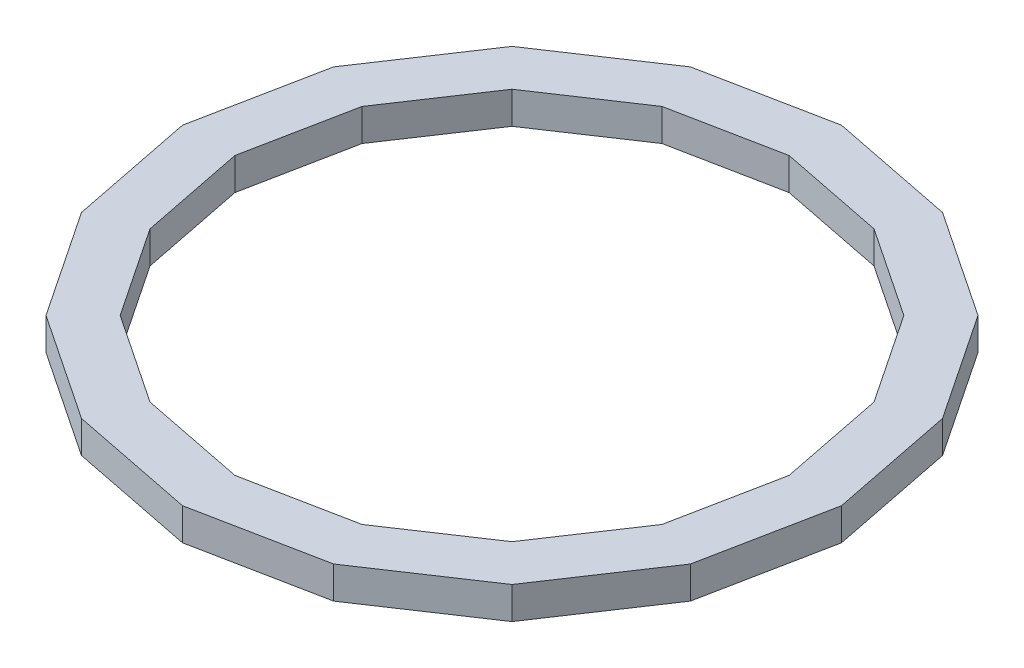
ISO-10303-21;
HEADER;
FILE_DESCRIPTION(('STEP AP214'),'2;1');
FILE_NAME('part.step','',(''),(''),'','','');
FILE_SCHEMA(('AUTOMOTIVE_DESIGN { 1 0 10303 214 1 1 1 1 }'));
ENDSEC;
DATA;
#1=APPLICATION_CONTEXT('core data for automotive mechanical design processes');
#2=APPLICATION_PROTOCOL_DEFINITION('international standard','automotive_design',2000,#1);
#3=PRODUCT_CONTEXT('',#1,'mechanical');
#4=PRODUCT('Part','Part','',(#3));
#5=PRODUCT_RELATED_PRODUCT_CATEGORY('part','',(#4));
#6=PRODUCT_DEFINITION_FORMATION('','',#4);
#7=PRODUCT_DEFINITION_CONTEXT('part definition',#1,'design');
#8=PRODUCT_DEFINITION('design','',#6,#7);
#9=PRODUCT_DEFINITION_SHAPE('','',#8);
#10=(LENGTH_UNIT() NAMED_UNIT(*) SI_UNIT(.MILLI.,.METRE.));
#11=(NAMED_UNIT(*) PLANE_ANGLE_UNIT() SI_UNIT($,.RADIAN.));
#12=(NAMED_UNIT(*) SI_UNIT($,.STERADIAN.) SOLID_ANGLE_UNIT());
#13=UNCERTAINTY_MEASURE_WITH_UNIT(LENGTH_MEASURE(1.E-05),#10,'distance_accuracy_value','');
#14=(GEOMETRIC_REPRESENTATION_CONTEXT(3) GLOBAL_UNCERTAINTY_ASSIGNED_CONTEXT((#13)) GLOBAL_UNIT_ASSIGNED_CONTEXT((#10,
#11,#12)) REPRESENTATION_CONTEXT('',''));
#15=CARTESIAN_POINT('',(0.,0.,0.));
#16=DIRECTION('',(0.,0.,1.));
#17=DIRECTION('',(1.,0.,0.));
#18=AXIS2_PLACEMENT_3D('',#15,#16,#17);
#19=CARTESIAN_POINT('',(0.,19.05,0.));
#20=DIRECTION('',(0.,1.,0.));
#21=DIRECTION('',(0.,0.,1.));
#22=AXIS2_PLACEMENT_3D('',#19,#20,#21);
#23=PLANE('',#22);
#24=DIRECTION('',(0.195090322016117,0.,-0.980785280403233));
#25=VECTOR('',#24,1.);
#26=CARTESIAN_POINT('',(180.428274580275,19.05,74.7358383667241));
#27=LINE('',#26,#25);
#28=CARTESIAN_POINT('',(180.428274580275,19.05,74.7358383667241));
#29=VERTEX_POINT('',#28);
#30=CARTESIAN_POINT('',(195.294157117903,19.05,-2.35922135911837E-12));
#31=VERTEX_POINT('',#30);
#32=EDGE_CURVE('E368',#29,#31,#27,.T.);
#33=ORIENTED_EDGE('',*,*,#32,.T.);
#34=DIRECTION('',(-0.19509032201614,0.,-0.980785280403228));
#35=VECTOR('',#34,1.);
#36=CARTESIAN_POINT('',(195.294157117903,19.05,-2.35922135911837E-12));
#37=LINE('',#36,#35);
#38=CARTESIAN_POINT('',(180.428274580273,19.05,-74.7358383667284));
#39=VERTEX_POINT('',#38);
#40=EDGE_CURVE('E371',#31,#39,#37,.T.);
#41=ORIENTED_EDGE('',*,*,#40,.T.);
#42=DIRECTION('',(-0.555570233019612,0.,-0.831469612302539));
#43=VECTOR('',#42,1.);
#44=CARTESIAN_POINT('',(180.428274580273,19.05,-74.7358383667284));
#45=LINE('',#44,#43);
#46=CARTESIAN_POINT('',(138.093822824179,19.05,-138.093822824182));
#47=VERTEX_POINT('',#46);
#48=EDGE_CURVE('E374',#39,#47,#45,.T.);
#49=ORIENTED_EDGE('',*,*,#48,.T.);
#50=DIRECTION('',(-0.831469612302552,0.,-0.555570233019592));
#51=VECTOR('',#50,1.);
#52=CARTESIAN_POINT('',(138.093822824179,19.05,-138.093822824182));
#53=LINE('',#52,#51);
#54=CARTESIAN_POINT('',(74.7358383667244,19.05,-180.428274580275));
#55=VERTEX_POINT('',#54);
#56=EDGE_CURVE('E376',#47,#55,#53,.T.);
#57=ORIENTED_EDGE('',*,*,#56,.T.);
#58=DIRECTION('',(-0.980785280403233,0.,-0.195090322016117));
#59=VECTOR('',#58,1.);
#60=CARTESIAN_POINT('',(74.7358383667244,19.05,-180.428274580275));
#61=LINE('',#60,#59);
#62=CARTESIAN_POINT('',(-2.24809405567046E-12,19.05,-195.294157117903));
#63=VERTEX_POINT('',#62);
#64=EDGE_CURVE('E378',#55,#63,#61,.T.);
#65=ORIENTED_EDGE('',*,*,#64,.T.);
#66=DIRECTION('',(-0.980785280403228,0.,0.19509032201614));
#67=VECTOR('',#66,1.);
#68=CARTESIAN_POINT('',(-2.24809405567046E-12,19.05,-195.294157117903));
#69=LINE('',#68,#67);
#70=CARTESIAN_POINT('',(-74.7358383667283,19.05,-180.428274580273));
#71=VERTEX_POINT('',#70);
#72=EDGE_CURVE('E380',#63,#71,#69,.T.);
#73=ORIENTED_EDGE('',*,*,#72,.T.);
#74=DIRECTION('',(-0.831469612302539,0.,0.555570233019612));
#75=VECTOR('',#74,1.);
#76=CARTESIAN_POINT('',(-74.7358383667283,19.05,-180.428274580273));
#77=LINE('',#76,#75);
#78=CARTESIAN_POINT('',(-138.093822824182,19.05,-138.093822824179));
#79=VERTEX_POINT('',#78);
#80=EDGE_CURVE('E382',#71,#79,#77,.T.);
#81=ORIENTED_EDGE('',*,*,#80,.T.);
#82=DIRECTION('',(-0.555570233019593,0.,0.831469612302552));
#83=VECTOR('',#82,1.);
#84=CARTESIAN_POINT('',(-138.093822824182,19.05,-138.093822824179));
#85=LINE('',#84,#83);
#86=CARTESIAN_POINT('',(-180.428274580275,19.05,-74.7358383667241));
#87=VERTEX_POINT('',#86);
#88=EDGE_CURVE('E384',#79,#87,#85,.T.);
#89=ORIENTED_EDGE('',*,*,#88,.T.);
#90=DIRECTION('',(-0.195090322016117,0.,0.980785280403233));
#91=VECTOR('',#90,1.);
#92=CARTESIAN_POINT('',(-180.428274580275,19.05,-74.7358383667241));
#93=LINE('',#92,#91);
#94=CARTESIAN_POINT('',(-195.294157117903,19.05,2.29036641027678E-12));
#95=VERTEX_POINT('',#94);
#96=EDGE_CURVE('E387',#87,#95,#93,.T.);
#97=ORIENTED_EDGE('',*,*,#96,.T.);
#98=DIRECTION('',(0.19509032201614,0.,0.980785280403228));
#99=VECTOR('',#98,1.);
#100=CARTESIAN_POINT('',(-195.294157117903,19.05,2.29036641027678E-12));
#101=LINE('',#100,#99);
#102=CARTESIAN_POINT('',(-180.428274580273,19.05,74.7358383667283));
#103=VERTEX_POINT('',#102);
#104=EDGE_CURVE('E389',#95,#103,#101,.T.);
#105=ORIENTED_EDGE('',*,*,#104,.T.);
#106=DIRECTION('',(0.555570233019612,0.,0.831469612302539));
#107=VECTOR('',#106,1.);
#108=CARTESIAN_POINT('',(-180.428274580273,19.05,74.7358383667283));
#109=LINE('',#108,#107);
#110=CARTESIAN_POINT('',(-138.093822824179,19.05,138.093822824182));
#111=VERTEX_POINT('',#110);
#112=EDGE_CURVE('E391',#103,#111,#109,.T.);
#113=ORIENTED_EDGE('',*,*,#112,.T.);
#114=DIRECTION('',(0.831469612302552,0.,0.555570233019592));
#115=VECTOR('',#114,1.);
#116=CARTESIAN_POINT('',(-138.093822824179,19.05,138.093822824182));
#117=LINE('',#116,#115);
#118=CARTESIAN_POINT('',(-74.735838366724,19.05,180.428274580275));
#119=VERTEX_POINT('',#118);
#120=EDGE_CURVE('E393',#111,#119,#117,.T.);
#121=ORIENTED_EDGE('',*,*,#120,.T.);
#122=DIRECTION('',(0.980785280403233,0.,0.195090322016117));
#123=VECTOR('',#122,1.);
#124=CARTESIAN_POINT('',(-74.735838366724,19.05,180.428274580275));
#125=LINE('',#124,#123);
#126=CARTESIAN_POINT('',(2.38062515005987E-12,19.05,195.294157117903));
#127=VERTEX_POINT('',#126);
#128=EDGE_CURVE('E395',#119,#127,#125,.T.);
#129=ORIENTED_EDGE('',*,*,#128,.T.);
#130=DIRECTION('',(0.980785280403228,0.,-0.19509032201614));
#131=VECTOR('',#130,1.);
#132=CARTESIAN_POINT('',(2.38062515005987E-12,19.05,195.294157117903));
#133=LINE('',#132,#131);
#134=CARTESIAN_POINT('',(74.7358383667283,19.05,180.428274580273));
#135=VERTEX_POINT('',#134);
#136=EDGE_CURVE('E397',#127,#135,#133,.T.);
#137=ORIENTED_EDGE('',*,*,#136,.T.);
#138=DIRECTION('',(0.831469612302539,0.,-0.555570233019612));
#139=VECTOR('',#138,1.);
#140=CARTESIAN_POINT('',(74.7358383667283,19.05,180.428274580273));
#141=LINE('',#140,#139);
#142=CARTESIAN_POINT('',(138.093822824182,19.05,138.093822824179));
#143=VERTEX_POINT('',#142);
#144=EDGE_CURVE('E399',#135,#143,#141,.T.);
#145=ORIENTED_EDGE('',*,*,#144,.T.);
#146=DIRECTION('',(0.555570233019593,0.,-0.831469612302552));
#147=VECTOR('',#146,1.);
#148=CARTESIAN_POINT('',(138.093822824182,19.05,138.093822824179));
#149=LINE('',#148,#147);
#150=EDGE_CURVE('E402',#143,#29,#149,.T.);
#151=ORIENTED_EDGE('',*,*,#150,.T.);
#152=EDGE_LOOP('',(#33,#41,#49,#57,#65,#73,#81,#89,#97,#105,#113,#121,#129,#137,#145,#151));
#153=FACE_BOUND('',#152,.T.);
#154=DIRECTION('',(-0.19509032201614,0.,-0.980785280403228));
#155=VECTOR('',#154,1.);
#156=CARTESIAN_POINT('',(164.217018615714,19.05,-1.98429536478422E-12));
#157=LINE('',#156,#155);
#158=CARTESIAN_POINT('',(164.217018615714,19.05,-1.98429536478422E-12));
#159=VERTEX_POINT('',#158);
#160=CARTESIAN_POINT('',(151.716742389082,19.05,-62.8431323366249));
#161=VERTEX_POINT('',#160);
#162=EDGE_CURVE('E252',#159,#161,#157,.T.);
#163=ORIENTED_EDGE('',*,*,#162,.F.);
#164=DIRECTION('',(0.195090322016117,0.,-0.980785280403233));
#165=VECTOR('',#164,1.);
#166=CARTESIAN_POINT('',(151.716742389083,19.05,62.8431323366213));
#167=LINE('',#166,#165);
#168=CARTESIAN_POINT('',(151.716742389083,19.05,62.8431323366213));
#169=VERTEX_POINT('',#168);
#170=EDGE_CURVE('E243',#169,#159,#167,.T.);
#171=ORIENTED_EDGE('',*,*,#170,.F.);
#172=DIRECTION('',(0.555570233019592,0.,-0.831469612302552));
#173=VECTOR('',#172,1.);
#174=CARTESIAN_POINT('',(116.11896744941,19.05,116.118967449407));
#175=LINE('',#174,#173);
#176=CARTESIAN_POINT('',(116.11896744941,19.05,116.118967449407));
#177=VERTEX_POINT('',#176);
#178=EDGE_CURVE('E294',#177,#169,#175,.T.);
#179=ORIENTED_EDGE('',*,*,#178,.F.);
#180=DIRECTION('',(0.831469612302539,0.,-0.555570233019612));
#181=VECTOR('',#180,1.);
#182=CARTESIAN_POINT('',(62.8431323366249,19.05,151.716742389082));
#183=LINE('',#182,#181);
#184=CARTESIAN_POINT('',(62.8431323366249,19.05,151.716742389082));
#185=VERTEX_POINT('',#184);
#186=EDGE_CURVE('E292',#185,#177,#183,.T.);
#187=ORIENTED_EDGE('',*,*,#186,.F.);
#188=DIRECTION('',(0.980785280403228,0.,-0.19509032201614));
#189=VECTOR('',#188,1.);
#190=CARTESIAN_POINT('',(1.95797760770945E-12,19.05,164.217018615714));
#191=LINE('',#190,#189);
#192=CARTESIAN_POINT('',(1.95797760770945E-12,19.05,164.217018615714));
#193=VERTEX_POINT('',#192);
#194=EDGE_CURVE('E290',#193,#185,#191,.T.);
#195=ORIENTED_EDGE('',*,*,#194,.F.);
#196=DIRECTION('',(0.980785280403233,0.,0.195090322016117));
#197=VECTOR('',#196,1.);
#198=CARTESIAN_POINT('',(-62.8431323366212,19.05,151.716742389083));
#199=LINE('',#198,#197);
#200=CARTESIAN_POINT('',(-62.8431323366212,19.05,151.716742389083));
#201=VERTEX_POINT('',#200);
#202=EDGE_CURVE('E288',#201,#193,#199,.T.);
#203=ORIENTED_EDGE('',*,*,#202,.F.);
#204=DIRECTION('',(0.831469612302552,0.,0.555570233019592));
#205=VECTOR('',#204,1.);
#206=CARTESIAN_POINT('',(-116.118967449407,19.05,116.11896744941));
#207=LINE('',#206,#205);
#208=CARTESIAN_POINT('',(-116.118967449407,19.05,116.11896744941));
#209=VERTEX_POINT('',#208);
#210=EDGE_CURVE('E286',#209,#201,#207,.T.);
#211=ORIENTED_EDGE('',*,*,#210,.F.);
#212=DIRECTION('',(0.555570233019612,0.,0.831469612302539));
#213=VECTOR('',#212,1.);
#214=CARTESIAN_POINT('',(-151.716742389082,19.05,62.843132336625));
#215=LINE('',#214,#213);
#216=CARTESIAN_POINT('',(-151.716742389082,19.05,62.843132336625));
#217=VERTEX_POINT('',#216);
#218=EDGE_CURVE('E284',#217,#209,#215,.T.);
#219=ORIENTED_EDGE('',*,*,#218,.F.);
#220=DIRECTION('',(0.19509032201614,0.,0.980785280403228));
#221=VECTOR('',#220,1.);
#222=CARTESIAN_POINT('',(-164.217018615713,19.05,2.00504577697434E-12));
#223=LINE('',#222,#221);
#224=CARTESIAN_POINT('',(-164.217018615713,19.05,2.00504577697434E-12));
#225=VERTEX_POINT('',#224);
#226=EDGE_CURVE('E282',#225,#217,#223,.T.);
#227=ORIENTED_EDGE('',*,*,#226,.F.);
#228=DIRECTION('',(-0.195090322016116,0.,0.980785280403233));
#229=VECTOR('',#228,1.);
#230=CARTESIAN_POINT('',(-151.716742389083,19.05,-62.8431323366213));
#231=LINE('',#230,#229);
#232=CARTESIAN_POINT('',(-151.716742389083,19.05,-62.8431323366213));
#233=VERTEX_POINT('',#232);
#234=EDGE_CURVE('E279',#233,#225,#231,.T.);
#235=ORIENTED_EDGE('',*,*,#234,.F.);
#236=DIRECTION('',(-0.555570233019592,0.,0.831469612302552));
#237=VECTOR('',#236,1.);
#238=CARTESIAN_POINT('',(-116.11896744941,19.05,-116.118967449407));
#239=LINE('',#238,#237);
#240=CARTESIAN_POINT('',(-116.11896744941,19.05,-116.118967449407));
#241=VERTEX_POINT('',#240);
#242=EDGE_CURVE('E277',#241,#233,#239,.T.);
#243=ORIENTED_EDGE('',*,*,#242,.F.);
#244=DIRECTION('',(-0.831469612302539,0.,0.555570233019612));
#245=VECTOR('',#244,1.);
#246=CARTESIAN_POINT('',(-62.8431323366248,19.05,-151.716742389082));
#247=LINE('',#246,#245);
#248=CARTESIAN_POINT('',(-62.8431323366248,19.05,-151.716742389082));
#249=VERTEX_POINT('',#248);
#250=EDGE_CURVE('E275',#249,#241,#247,.T.);
#251=ORIENTED_EDGE('',*,*,#250,.F.);
#252=DIRECTION('',(-0.980785280403228,0.,0.19509032201614));
#253=VECTOR('',#252,1.);
#254=CARTESIAN_POINT('',(-1.97042515166565E-12,19.05,-164.217018615713));
#255=LINE('',#254,#253);
#256=CARTESIAN_POINT('',(-1.97042515166565E-12,19.05,-164.217018615713));
#257=VERTEX_POINT('',#256);
#258=EDGE_CURVE('E273',#257,#249,#255,.T.);
#259=ORIENTED_EDGE('',*,*,#258,.F.);
#260=DIRECTION('',(-0.980785280403233,0.,-0.195090322016117));
#261=VECTOR('',#260,1.);
#262=CARTESIAN_POINT('',(62.8431323366215,19.05,-151.716742389083));
#263=LINE('',#262,#261);
#264=CARTESIAN_POINT('',(62.8431323366215,19.05,-151.716742389083));
#265=VERTEX_POINT('',#264);
#266=EDGE_CURVE('E271',#265,#257,#263,.T.);
#267=ORIENTED_EDGE('',*,*,#266,.F.);
#268=DIRECTION('',(-0.831469612302552,0.,-0.555570233019592));
#269=VECTOR('',#268,1.);
#270=CARTESIAN_POINT('',(116.118967449407,19.05,-116.11896744941));
#271=LINE('',#270,#269);
#272=CARTESIAN_POINT('',(116.118967449407,19.05,-116.11896744941));
#273=VERTEX_POINT('',#272);
#274=EDGE_CURVE('E267',#273,#265,#271,.T.);
#275=ORIENTED_EDGE('',*,*,#274,.F.);
#276=DIRECTION('',(-0.555570233019612,0.,-0.831469612302539));
#277=VECTOR('',#276,1.);
#278=CARTESIAN_POINT('',(151.716742389082,19.05,-62.8431323366249));
#279=LINE('',#278,#277);
#280=EDGE_CURVE('E265',#161,#273,#279,.T.);
#281=ORIENTED_EDGE('',*,*,#280,.F.);
#282=EDGE_LOOP('',(#163,#171,#179,#187,#195,#203,#211,#219,#227,#235,#243,#251,#259,#267,#275,#281));
#283=FACE_BOUND('',#282,.T.);
#284=ADVANCED_FACE('F34',(#153,#283),#23,.T.);
#285=CARTESIAN_POINT('',(0.,0.,0.));
#286=DIRECTION('',(0.,1.,0.));
#287=DIRECTION('',(0.,0.,1.));
#288=AXIS2_PLACEMENT_3D('',#285,#286,#287);
#289=PLANE('',#288);
#290=DIRECTION('',(0.195090322016117,0.,-0.980785280403233));
#291=VECTOR('',#290,1.);
#292=CARTESIAN_POINT('',(180.428274580275,0.,74.7358383667241));
#293=LINE('',#292,#291);
#294=CARTESIAN_POINT('',(180.428274580275,0.,74.7358383667241));
#295=VERTEX_POINT('',#294);
#296=CARTESIAN_POINT('',(195.294157117903,0.,-2.35922135911837E-12));
#297=VERTEX_POINT('',#296);
#298=EDGE_CURVE('E260',#295,#297,#293,.T.);
#299=ORIENTED_EDGE('',*,*,#298,.F.);
#300=DIRECTION('',(0.555570233019593,0.,-0.831469612302552));
#301=VECTOR('',#300,1.);
#302=CARTESIAN_POINT('',(138.093822824182,0.,138.093822824179));
#303=LINE('',#302,#301);
#304=CARTESIAN_POINT('',(138.093822824182,0.,138.093822824179));
#305=VERTEX_POINT('',#304);
#306=EDGE_CURVE('E372',#305,#295,#303,.T.);
#307=ORIENTED_EDGE('',*,*,#306,.F.);
#308=DIRECTION('',(0.831469612302539,0.,-0.555570233019612));
#309=VECTOR('',#308,1.);
#310=CARTESIAN_POINT('',(74.7358383667283,0.,180.428274580273));
#311=LINE('',#310,#309);
#312=CARTESIAN_POINT('',(74.7358383667283,0.,180.428274580273));
#313=VERTEX_POINT('',#312);
#314=EDGE_CURVE('E433',#313,#305,#311,.T.);
#315=ORIENTED_EDGE('',*,*,#314,.F.);
#316=DIRECTION('',(0.980785280403228,0.,-0.19509032201614));
#317=VECTOR('',#316,1.);
#318=CARTESIAN_POINT('',(2.38062515005987E-12,0.,195.294157117903));
#319=LINE('',#318,#317);
#320=CARTESIAN_POINT('',(2.38062515005987E-12,0.,195.294157117903));
#321=VERTEX_POINT('',#320);
#322=EDGE_CURVE('E431',#321,#313,#319,.T.);
#323=ORIENTED_EDGE('',*,*,#322,.F.);
#324=DIRECTION('',(0.980785280403233,0.,0.195090322016117));
#325=VECTOR('',#324,1.);
#326=CARTESIAN_POINT('',(-74.735838366724,0.,180.428274580275));
#327=LINE('',#326,#325);
#328=CARTESIAN_POINT('',(-74.735838366724,0.,180.428274580275));
#329=VERTEX_POINT('',#328);
#330=EDGE_CURVE('E429',#329,#321,#327,.T.);
#331=ORIENTED_EDGE('',*,*,#330,.F.);
#332=DIRECTION('',(0.831469612302552,0.,0.555570233019592));
#333=VECTOR('',#332,1.);
#334=CARTESIAN_POINT('',(-138.093822824179,0.,138.093822824182));
#335=LINE('',#334,#333);
#336=CARTESIAN_POINT('',(-138.093822824179,0.,138.093822824182));
#337=VERTEX_POINT('',#336);
#338=EDGE_CURVE('E427',#337,#329,#335,.T.);
#339=ORIENTED_EDGE('',*,*,#338,.F.);
#340=DIRECTION('',(0.555570233019612,0.,0.831469612302539));
#341=VECTOR('',#340,1.);
#342=CARTESIAN_POINT('',(-180.428274580273,0.,74.7358383667283));
#343=LINE('',#342,#341);
#344=CARTESIAN_POINT('',(-180.428274580273,0.,74.7358383667283));
#345=VERTEX_POINT('',#344);
#346=EDGE_CURVE('E425',#345,#337,#343,.T.);
#347=ORIENTED_EDGE('',*,*,#346,.F.);
#348=DIRECTION('',(0.19509032201614,0.,0.980785280403228));
#349=VECTOR('',#348,1.);
#350=CARTESIAN_POINT('',(-195.294157117903,0.,2.29036641027678E-12));
#351=LINE('',#350,#349);
#352=CARTESIAN_POINT('',(-195.294157117903,0.,2.29036641027678E-12));
#353=VERTEX_POINT('',#352);
#354=EDGE_CURVE('E423',#353,#345,#351,.T.);
#355=ORIENTED_EDGE('',*,*,#354,.F.);
#356=DIRECTION('',(-0.195090322016117,0.,0.980785280403233));
#357=VECTOR('',#356,1.);
#358=CARTESIAN_POINT('',(-180.428274580275,0.,-74.7358383667241));
#359=LINE('',#358,#357);
#360=CARTESIAN_POINT('',(-180.428274580275,0.,-74.7358383667241));
#361=VERTEX_POINT('',#360);
#362=EDGE_CURVE('E421',#361,#353,#359,.T.);
#363=ORIENTED_EDGE('',*,*,#362,.F.);
#364=DIRECTION('',(-0.555570233019593,0.,0.831469612302552));
#365=VECTOR('',#364,1.);
#366=CARTESIAN_POINT('',(-138.093822824182,0.,-138.093822824179));
#367=LINE('',#366,#365);
#368=CARTESIAN_POINT('',(-138.093822824182,0.,-138.093822824179));
#369=VERTEX_POINT('',#368);
#370=EDGE_CURVE('E419',#369,#361,#367,.T.);
#371=ORIENTED_EDGE('',*,*,#370,.F.);
#372=DIRECTION('',(-0.831469612302539,0.,0.555570233019612));
#373=VECTOR('',#372,1.);
#374=CARTESIAN_POINT('',(-74.7358383667283,0.,-180.428274580273));
#375=LINE('',#374,#373);
#376=CARTESIAN_POINT('',(-74.7358383667283,0.,-180.428274580273));
#377=VERTEX_POINT('',#376);
#378=EDGE_CURVE('E417',#377,#369,#375,.T.);
#379=ORIENTED_EDGE('',*,*,#378,.F.);
#380=DIRECTION('',(-0.980785280403228,0.,0.19509032201614));
#381=VECTOR('',#380,1.);
#382=CARTESIAN_POINT('',(-2.24809405567046E-12,0.,-195.294157117903));
#383=LINE('',#382,#381);
#384=CARTESIAN_POINT('',(-2.24809405567046E-12,0.,-195.294157117903));
#385=VERTEX_POINT('',#384);
#386=EDGE_CURVE('E415',#385,#377,#383,.T.);
#387=ORIENTED_EDGE('',*,*,#386,.F.);
#388=DIRECTION('',(-0.980785280403233,0.,-0.195090322016117));
#389=VECTOR('',#388,1.);
#390=CARTESIAN_POINT('',(74.7358383667244,0.,-180.428274580275));
#391=LINE('',#390,#389);
#392=CARTESIAN_POINT('',(74.7358383667244,0.,-180.428274580275));
#393=VERTEX_POINT('',#392);
#394=EDGE_CURVE('E413',#393,#385,#391,.T.);
#395=ORIENTED_EDGE('',*,*,#394,.F.);
#396=DIRECTION('',(-0.831469612302552,0.,-0.555570233019592));
#397=VECTOR('',#396,1.);
#398=CARTESIAN_POINT('',(138.093822824179,0.,-138.093822824182));
#399=LINE('',#398,#397);
#400=CARTESIAN_POINT('',(138.093822824179,0.,-138.093822824182));
#401=VERTEX_POINT('',#400);
#402=EDGE_CURVE('E411',#401,#393,#399,.T.);
#403=ORIENTED_EDGE('',*,*,#402,.F.);
#404=DIRECTION('',(-0.555570233019612,0.,-0.831469612302539));
#405=VECTOR('',#404,1.);
#406=CARTESIAN_POINT('',(180.428274580273,0.,-74.7358383667284));
#407=LINE('',#406,#405);
#408=CARTESIAN_POINT('',(180.428274580273,0.,-74.7358383667284));
#409=VERTEX_POINT('',#408);
#410=EDGE_CURVE('E409',#409,#401,#407,.T.);
#411=ORIENTED_EDGE('',*,*,#410,.F.);
#412=DIRECTION('',(-0.19509032201614,0.,-0.980785280403228));
#413=VECTOR('',#412,1.);
#414=CARTESIAN_POINT('',(195.294157117903,0.,-2.35922135911837E-12));
#415=LINE('',#414,#413);
#416=EDGE_CURVE('E407',#297,#409,#415,.T.);
#417=ORIENTED_EDGE('',*,*,#416,.F.);
#418=EDGE_LOOP('',(#299,#307,#315,#323,#331,#339,#347,#355,#363,#371,#379,#387,#395,#403,#411,#417));
#419=FACE_BOUND('',#418,.T.);
#420=DIRECTION('',(0.195090322016117,0.,-0.980785280403233));
#421=VECTOR('',#420,1.);
#422=CARTESIAN_POINT('',(151.716742389083,0.,62.8431323366213));
#423=LINE('',#422,#421);
#424=CARTESIAN_POINT('',(151.716742389083,0.,62.8431323366213));
#425=VERTEX_POINT('',#424);
#426=CARTESIAN_POINT('',(164.217018615714,0.,-1.98429536478422E-12));
#427=VERTEX_POINT('',#426);
#428=EDGE_CURVE('E57',#425,#427,#423,.T.);
#429=ORIENTED_EDGE('',*,*,#428,.T.);
#430=DIRECTION('',(-0.19509032201614,0.,-0.980785280403228));
#431=VECTOR('',#430,1.);
#432=CARTESIAN_POINT('',(164.217018615714,0.,-1.98429536478422E-12));
#433=LINE('',#432,#431);
#434=CARTESIAN_POINT('',(151.716742389082,0.,-62.8431323366249));
#435=VERTEX_POINT('',#434);
#436=EDGE_CURVE('E259',#427,#435,#433,.T.);
#437=ORIENTED_EDGE('',*,*,#436,.T.);
#438=DIRECTION('',(-0.555570233019612,0.,-0.831469612302539));
#439=VECTOR('',#438,1.);
#440=CARTESIAN_POINT('',(151.716742389082,0.,-62.8431323366249));
#441=LINE('',#440,#439);
#442=CARTESIAN_POINT('',(116.118967449407,0.,-116.11896744941));
#443=VERTEX_POINT('',#442);
#444=EDGE_CURVE('E298',#435,#443,#441,.T.);
#445=ORIENTED_EDGE('',*,*,#444,.T.);
#446=DIRECTION('',(-0.831469612302552,0.,-0.555570233019592));
#447=VECTOR('',#446,1.);
#448=CARTESIAN_POINT('',(116.118967449407,0.,-116.11896744941));
#449=LINE('',#448,#447);
#450=CARTESIAN_POINT('',(62.8431323366215,0.,-151.716742389083));
#451=VERTEX_POINT('',#450);
#452=EDGE_CURVE('E301',#443,#451,#449,.T.);
#453=ORIENTED_EDGE('',*,*,#452,.T.);
#454=DIRECTION('',(-0.980785280403233,0.,-0.195090322016117));
#455=VECTOR('',#454,1.);
#456=CARTESIAN_POINT('',(62.8431323366215,0.,-151.716742389083));
#457=LINE('',#456,#455);
#458=CARTESIAN_POINT('',(-1.97042515166565E-12,0.,-164.217018615713));
#459=VERTEX_POINT('',#458);
#460=EDGE_CURVE('E304',#451,#459,#457,.T.);
#461=ORIENTED_EDGE('',*,*,#460,.T.);
#462=DIRECTION('',(-0.980785280403228,0.,0.19509032201614));
#463=VECTOR('',#462,1.);
#464=CARTESIAN_POINT('',(-1.97042515166565E-12,0.,-164.217018615713));
#465=LINE('',#464,#463);
#466=CARTESIAN_POINT('',(-62.8431323366248,0.,-151.716742389082));
#467=VERTEX_POINT('',#466);
#468=EDGE_CURVE('E307',#459,#467,#465,.T.);
#469=ORIENTED_EDGE('',*,*,#468,.T.);
#470=DIRECTION('',(-0.831469612302539,0.,0.555570233019612));
#471=VECTOR('',#470,1.);
#472=CARTESIAN_POINT('',(-62.8431323366248,0.,-151.716742389082));
#473=LINE('',#472,#471);
#474=CARTESIAN_POINT('',(-116.11896744941,0.,-116.118967449407));
#475=VERTEX_POINT('',#474);
#476=EDGE_CURVE('E310',#467,#475,#473,.T.);
#477=ORIENTED_EDGE('',*,*,#476,.T.);
#478=DIRECTION('',(-0.555570233019592,0.,0.831469612302552));
#479=VECTOR('',#478,1.);
#480=CARTESIAN_POINT('',(-116.11896744941,0.,-116.118967449407));
#481=LINE('',#480,#479);
#482=CARTESIAN_POINT('',(-151.716742389083,0.,-62.8431323366213));
#483=VERTEX_POINT('',#482);
#484=EDGE_CURVE('E313',#475,#483,#481,.T.);
#485=ORIENTED_EDGE('',*,*,#484,.T.);
#486=DIRECTION('',(-0.195090322016116,0.,0.980785280403233));
#487=VECTOR('',#486,1.);
#488=CARTESIAN_POINT('',(-151.716742389083,0.,-62.8431323366213));
#489=LINE('',#488,#487);
#490=CARTESIAN_POINT('',(-164.217018615713,0.,2.00504577697434E-12));
#491=VERTEX_POINT('',#490);
#492=EDGE_CURVE('E316',#483,#491,#489,.T.);
#493=ORIENTED_EDGE('',*,*,#492,.T.);
#494=DIRECTION('',(0.19509032201614,0.,0.980785280403228));
#495=VECTOR('',#494,1.);
#496=CARTESIAN_POINT('',(-164.217018615713,0.,2.00504577697434E-12));
#497=LINE('',#496,#495);
#498=CARTESIAN_POINT('',(-151.716742389082,0.,62.843132336625));
#499=VERTEX_POINT('',#498);
#500=EDGE_CURVE('E320',#491,#499,#497,.T.);
#501=ORIENTED_EDGE('',*,*,#500,.T.);
#502=DIRECTION('',(0.555570233019612,0.,0.831469612302539));
#503=VECTOR('',#502,1.);
#504=CARTESIAN_POINT('',(-151.716742389082,0.,62.843132336625));
#505=LINE('',#504,#503);
#506=CARTESIAN_POINT('',(-116.118967449407,0.,116.11896744941));
#507=VERTEX_POINT('',#506);
#508=EDGE_CURVE('E323',#499,#507,#505,.T.);
#509=ORIENTED_EDGE('',*,*,#508,.T.);
#510=DIRECTION('',(0.831469612302552,0.,0.555570233019592));
#511=VECTOR('',#510,1.);
#512=CARTESIAN_POINT('',(-116.118967449407,0.,116.11896744941));
#513=LINE('',#512,#511);
#514=CARTESIAN_POINT('',(-62.8431323366212,0.,151.716742389083));
#515=VERTEX_POINT('',#514);
#516=EDGE_CURVE('E326',#507,#515,#513,.T.);
#517=ORIENTED_EDGE('',*,*,#516,.T.);
#518=DIRECTION('',(0.980785280403233,0.,0.195090322016117));
#519=VECTOR('',#518,1.);
#520=CARTESIAN_POINT('',(-62.8431323366212,0.,151.716742389083));
#521=LINE('',#520,#519);
#522=CARTESIAN_POINT('',(1.95797760770945E-12,0.,164.217018615714));
#523=VERTEX_POINT('',#522);
#524=EDGE_CURVE('E329',#515,#523,#521,.T.);
#525=ORIENTED_EDGE('',*,*,#524,.T.);
#526=DIRECTION('',(0.980785280403228,0.,-0.19509032201614));
#527=VECTOR('',#526,1.);
#528=CARTESIAN_POINT('',(1.95797760770945E-12,0.,164.217018615714));
#529=LINE('',#528,#527);
#530=CARTESIAN_POINT('',(62.8431323366249,0.,151.716742389082));
#531=VERTEX_POINT('',#530);
#532=EDGE_CURVE('E332',#523,#531,#529,.T.);
#533=ORIENTED_EDGE('',*,*,#532,.T.);
#534=DIRECTION('',(0.831469612302539,0.,-0.555570233019612));
#535=VECTOR('',#534,1.);
#536=CARTESIAN_POINT('',(62.8431323366249,0.,151.716742389082));
#537=LINE('',#536,#535);
#538=CARTESIAN_POINT('',(116.11896744941,0.,116.118967449407));
#539=VERTEX_POINT('',#538);
#540=EDGE_CURVE('E335',#531,#539,#537,.T.);
#541=ORIENTED_EDGE('',*,*,#540,.T.);
#542=DIRECTION('',(0.555570233019592,0.,-0.831469612302552));
#543=VECTOR('',#542,1.);
#544=CARTESIAN_POINT('',(116.11896744941,0.,116.118967449407));
#545=LINE('',#544,#543);
#546=EDGE_CURVE('E253',#539,#425,#545,.T.);
#547=ORIENTED_EDGE('',*,*,#546,.T.);
#548=EDGE_LOOP('',(#429,#437,#445,#453,#461,#469,#477,#485,#493,#501,#509,#517,#525,#533,#541,#547));
#549=FACE_BOUND('',#548,.T.);
#550=ADVANCED_FACE('F488',(#419,#549),#289,.F.);
#551=CARTESIAN_POINT('',(180.428274580275,19.05,74.7358383667241));
#552=DIRECTION('',(-0.980785280403233,0.,-0.195090322016117));
#553=DIRECTION('',(-0.195090322016117,0.,0.980785280403233));
#554=AXIS2_PLACEMENT_3D('',#551,#552,#553);
#555=PLANE('',#554);
#556=ORIENTED_EDGE('',*,*,#298,.T.);
#557=DIRECTION('',(0.,-1.,0.));
#558=VECTOR('',#557,1.);
#559=CARTESIAN_POINT('',(195.294157117903,19.05,-2.35922135911837E-12));
#560=LINE('',#559,#558);
#561=EDGE_CURVE('E11',#31,#297,#560,.T.);
#562=ORIENTED_EDGE('',*,*,#561,.F.);
#563=ORIENTED_EDGE('',*,*,#32,.F.);
#564=DIRECTION('',(0.,-1.,0.));
#565=VECTOR('',#564,1.);
#566=CARTESIAN_POINT('',(180.428274580275,19.05,74.7358383667241));
#567=LINE('',#566,#565);
#568=EDGE_CURVE('E404',#29,#295,#567,.T.);
#569=ORIENTED_EDGE('',*,*,#568,.T.);
#570=EDGE_LOOP('',(#556,#562,#563,#569));
#571=FACE_BOUND('',#570,.T.);
#572=ADVANCED_FACE('F36',(#571),#555,.F.);
#573=CARTESIAN_POINT('',(195.294157117903,19.05,-2.35922135911837E-12));
#574=DIRECTION('',(-0.980785280403228,0.,0.19509032201614));
#575=DIRECTION('',(0.19509032201614,0.,0.980785280403228));
#576=AXIS2_PLACEMENT_3D('',#573,#574,#575);
#577=PLANE('',#576);
#578=ORIENTED_EDGE('',*,*,#416,.T.);
#579=DIRECTION('',(0.,-1.,0.));
#580=VECTOR('',#579,1.);
#581=CARTESIAN_POINT('',(180.428274580273,19.05,-74.7358383667284));
#582=LINE('',#581,#580);
#583=EDGE_CURVE('E42',#39,#409,#582,.T.);
#584=ORIENTED_EDGE('',*,*,#583,.F.);
#585=ORIENTED_EDGE('',*,*,#40,.F.);
#586=ORIENTED_EDGE('',*,*,#561,.T.);
#587=EDGE_LOOP('',(#578,#584,#585,#586));
#588=FACE_BOUND('',#587,.T.);
#589=ADVANCED_FACE('F505',(#588),#577,.F.);
#590=CARTESIAN_POINT('',(180.428274580273,19.05,-74.7358383667284));
#591=DIRECTION('',(-0.831469612302539,0.,0.555570233019612));
#592=DIRECTION('',(0.555570233019612,0.,0.831469612302539));
#593=AXIS2_PLACEMENT_3D('',#590,#591,#592);
#594=PLANE('',#593);
#595=ORIENTED_EDGE('',*,*,#410,.T.);
#596=DIRECTION('',(0.,-1.,0.));
#597=VECTOR('',#596,1.);
#598=CARTESIAN_POINT('',(138.093822824179,19.05,-138.093822824182));
#599=LINE('',#598,#597);
#600=EDGE_CURVE('E475',#47,#401,#599,.T.);
#601=ORIENTED_EDGE('',*,*,#600,.F.);
#602=ORIENTED_EDGE('',*,*,#48,.F.);
#603=ORIENTED_EDGE('',*,*,#583,.T.);
#604=EDGE_LOOP('',(#595,#601,#602,#603));
#605=FACE_BOUND('',#604,.T.);
#606=ADVANCED_FACE('F482',(#605),#594,.F.);
#607=CARTESIAN_POINT('',(138.093822824179,19.05,-138.093822824182));
#608=DIRECTION('',(-0.555570233019592,0.,0.831469612302552));
#609=DIRECTION('',(0.831469612302552,0.,0.555570233019592));
#610=AXIS2_PLACEMENT_3D('',#607,#608,#609);
#611=PLANE('',#610);
#612=ORIENTED_EDGE('',*,*,#402,.T.);
#613=DIRECTION('',(0.,-1.,0.));
#614=VECTOR('',#613,1.);
#615=CARTESIAN_POINT('',(74.7358383667244,19.05,-180.428274580275));
#616=LINE('',#615,#614);
#617=EDGE_CURVE('E471',#55,#393,#616,.T.);
#618=ORIENTED_EDGE('',*,*,#617,.F.);
#619=ORIENTED_EDGE('',*,*,#56,.F.);
#620=ORIENTED_EDGE('',*,*,#600,.T.);
#621=EDGE_LOOP('',(#612,#618,#619,#620));
#622=FACE_BOUND('',#621,.T.);
#623=ADVANCED_FACE('F494',(#622),#611,.F.);
#624=CARTESIAN_POINT('',(74.7358383667244,19.05,-180.428274580275));
#625=DIRECTION('',(-0.195090322016117,0.,0.980785280403233));
#626=DIRECTION('',(0.980785280403233,0.,0.195090322016117));
#627=AXIS2_PLACEMENT_3D('',#624,#625,#626);
#628=PLANE('',#627);
#629=ORIENTED_EDGE('',*,*,#394,.T.);
#630=DIRECTION('',(0.,-1.,0.));
#631=VECTOR('',#630,1.);
#632=CARTESIAN_POINT('',(-2.24809405567046E-12,19.05,-195.294157117903));
#633=LINE('',#632,#631);
#634=EDGE_CURVE('E468',#63,#385,#633,.T.);
#635=ORIENTED_EDGE('',*,*,#634,.F.);
#636=ORIENTED_EDGE('',*,*,#64,.F.);
#637=ORIENTED_EDGE('',*,*,#617,.T.);
#638=EDGE_LOOP('',(#629,#635,#636,#637));
#639=FACE_BOUND('',#638,.T.);
#640=ADVANCED_FACE('F498',(#639),#628,.F.);
#641=CARTESIAN_POINT('',(-2.24809405567046E-12,19.05,-195.294157117903));
#642=DIRECTION('',(0.19509032201614,0.,0.980785280403228));
#643=DIRECTION('',(0.980785280403228,0.,-0.19509032201614));
#644=AXIS2_PLACEMENT_3D('',#641,#642,#643);
#645=PLANE('',#644);
#646=ORIENTED_EDGE('',*,*,#386,.T.);
#647=DIRECTION('',(0.,-1.,0.));
#648=VECTOR('',#647,1.);
#649=CARTESIAN_POINT('',(-74.7358383667283,19.05,-180.428274580273));
#650=LINE('',#649,#648);
#651=EDGE_CURVE('E465',#71,#377,#650,.T.);
#652=ORIENTED_EDGE('',*,*,#651,.F.);
#653=ORIENTED_EDGE('',*,*,#72,.F.);
#654=ORIENTED_EDGE('',*,*,#634,.T.);
#655=EDGE_LOOP('',(#646,#652,#653,#654));
#656=FACE_BOUND('',#655,.T.);
#657=ADVANCED_FACE('F558',(#656),#645,.F.);
#658=CARTESIAN_POINT('',(-74.7358383667283,19.05,-180.428274580273));
#659=DIRECTION('',(0.555570233019612,0.,0.831469612302539));
#660=DIRECTION('',(0.831469612302539,0.,-0.555570233019612));
#661=AXIS2_PLACEMENT_3D('',#658,#659,#660);
#662=PLANE('',#661);
#663=ORIENTED_EDGE('',*,*,#378,.T.);
#664=DIRECTION('',(0.,-1.,0.));
#665=VECTOR('',#664,1.);
#666=CARTESIAN_POINT('',(-138.093822824182,19.05,-138.093822824179));
#667=LINE('',#666,#665);
#668=EDGE_CURVE('E462',#79,#369,#667,.T.);
#669=ORIENTED_EDGE('',*,*,#668,.F.);
#670=ORIENTED_EDGE('',*,*,#80,.F.);
#671=ORIENTED_EDGE('',*,*,#651,.T.);
#672=EDGE_LOOP('',(#663,#669,#670,#671));
#673=FACE_BOUND('',#672,.T.);
#674=ADVANCED_FACE('F555',(#673),#662,.F.);
#675=CARTESIAN_POINT('',(-138.093822824182,19.05,-138.093822824179));
#676=DIRECTION('',(0.831469612302552,0.,0.555570233019592));
#677=DIRECTION('',(0.555570233019593,0.,-0.831469612302552));
#678=AXIS2_PLACEMENT_3D('',#675,#676,#677);
#679=PLANE('',#678);
#680=ORIENTED_EDGE('',*,*,#370,.T.);
#681=DIRECTION('',(0.,-1.,0.));
#682=VECTOR('',#681,1.);
#683=CARTESIAN_POINT('',(-180.428274580275,19.05,-74.7358383667241));
#684=LINE('',#683,#682);
#685=EDGE_CURVE('E459',#87,#361,#684,.T.);
#686=ORIENTED_EDGE('',*,*,#685,.F.);
#687=ORIENTED_EDGE('',*,*,#88,.F.);
#688=ORIENTED_EDGE('',*,*,#668,.T.);
#689=EDGE_LOOP('',(#680,#686,#687,#688));
#690=FACE_BOUND('',#689,.T.);
#691=ADVANCED_FACE('F551',(#690),#679,.F.);
#692=CARTESIAN_POINT('',(-180.428274580275,19.05,-74.7358383667241));
#693=DIRECTION('',(0.980785280403233,0.,0.195090322016117));
#694=DIRECTION('',(0.195090322016117,0.,-0.980785280403233));
#695=AXIS2_PLACEMENT_3D('',#692,#693,#694);
#696=PLANE('',#695);
#697=ORIENTED_EDGE('',*,*,#362,.T.);
#698=DIRECTION('',(0.,-1.,0.));
#699=VECTOR('',#698,1.);
#700=CARTESIAN_POINT('',(-195.294157117903,19.05,2.29036641027678E-12));
#701=LINE('',#700,#699);
#702=EDGE_CURVE('E456',#95,#353,#701,.T.);
#703=ORIENTED_EDGE('',*,*,#702,.F.);
#704=ORIENTED_EDGE('',*,*,#96,.F.);
#705=ORIENTED_EDGE('',*,*,#685,.T.);
#706=EDGE_LOOP('',(#697,#703,#704,#705));
#707=FACE_BOUND('',#706,.T.);
#708=ADVANCED_FACE('F547',(#707),#696,.F.);
#709=CARTESIAN_POINT('',(-195.294157117903,19.05,2.29036641027678E-12));
#710=DIRECTION('',(0.980785280403228,0.,-0.19509032201614));
#711=DIRECTION('',(-0.19509032201614,0.,-0.980785280403228));
#712=AXIS2_PLACEMENT_3D('',#709,#710,#711);
#713=PLANE('',#712);
#714=ORIENTED_EDGE('',*,*,#354,.T.);
#715=DIRECTION('',(0.,-1.,0.));
#716=VECTOR('',#715,1.);
#717=CARTESIAN_POINT('',(-180.428274580273,19.05,74.7358383667283));
#718=LINE('',#717,#716);
#719=EDGE_CURVE('E453',#103,#345,#718,.T.);
#720=ORIENTED_EDGE('',*,*,#719,.F.);
#721=ORIENTED_EDGE('',*,*,#104,.F.);
#722=ORIENTED_EDGE('',*,*,#702,.T.);
#723=EDGE_LOOP('',(#714,#720,#721,#722));
#724=FACE_BOUND('',#723,.T.);
#725=ADVANCED_FACE('F542',(#724),#713,.F.);
#726=CARTESIAN_POINT('',(-180.428274580273,19.05,74.7358383667283));
#727=DIRECTION('',(0.831469612302539,0.,-0.555570233019612));
#728=DIRECTION('',(-0.555570233019612,0.,-0.831469612302539));
#729=AXIS2_PLACEMENT_3D('',#726,#727,#728);
#730=PLANE('',#729);
#731=ORIENTED_EDGE('',*,*,#346,.T.);
#732=DIRECTION('',(0.,-1.,0.));
#733=VECTOR('',#732,1.);
#734=CARTESIAN_POINT('',(-138.093822824179,19.05,138.093822824182));
#735=LINE('',#734,#733);
#736=EDGE_CURVE('E450',#111,#337,#735,.T.);
#737=ORIENTED_EDGE('',*,*,#736,.F.);
#738=ORIENTED_EDGE('',*,*,#112,.F.);
#739=ORIENTED_EDGE('',*,*,#719,.T.);
#740=EDGE_LOOP('',(#731,#737,#738,#739));
#741=FACE_BOUND('',#740,.T.);
#742=ADVANCED_FACE('F536',(#741),#730,.F.);
#743=CARTESIAN_POINT('',(-138.093822824179,19.05,138.093822824182));
#744=DIRECTION('',(0.555570233019592,0.,-0.831469612302552));
#745=DIRECTION('',(-0.831469612302552,0.,-0.555570233019592));
#746=AXIS2_PLACEMENT_3D('',#743,#744,#745);
#747=PLANE('',#746);
#748=ORIENTED_EDGE('',*,*,#338,.T.);
#749=DIRECTION('',(0.,-1.,0.));
#750=VECTOR('',#749,1.);
#751=CARTESIAN_POINT('',(-74.735838366724,19.05,180.428274580275));
#752=LINE('',#751,#750);
#753=EDGE_CURVE('E447',#119,#329,#752,.T.);
#754=ORIENTED_EDGE('',*,*,#753,.F.);
#755=ORIENTED_EDGE('',*,*,#120,.F.);
#756=ORIENTED_EDGE('',*,*,#736,.T.);
#757=EDGE_LOOP('',(#748,#754,#755,#756));
#758=FACE_BOUND('',#757,.T.);
#759=ADVANCED_FACE('F532',(#758),#747,.F.);
#760=CARTESIAN_POINT('',(-74.735838366724,19.05,180.428274580275));
#761=DIRECTION('',(0.195090322016117,0.,-0.980785280403233));
#762=DIRECTION('',(-0.980785280403233,0.,-0.195090322016117));
#763=AXIS2_PLACEMENT_3D('',#760,#761,#762);
#764=PLANE('',#763);
#765=ORIENTED_EDGE('',*,*,#330,.T.);
#766=DIRECTION('',(0.,-1.,0.));
#767=VECTOR('',#766,1.);
#768=CARTESIAN_POINT('',(2.38062515005987E-12,19.05,195.294157117903));
#769=LINE('',#768,#767);
#770=EDGE_CURVE('E444',#127,#321,#769,.T.);
#771=ORIENTED_EDGE('',*,*,#770,.F.);
#772=ORIENTED_EDGE('',*,*,#128,.F.);
#773=ORIENTED_EDGE('',*,*,#753,.T.);
#774=EDGE_LOOP('',(#765,#771,#772,#773));
#775=FACE_BOUND('',#774,.T.);
#776=ADVANCED_FACE('F527',(#775),#764,.F.);
#777=CARTESIAN_POINT('',(2.38062515005987E-12,19.05,195.294157117903));
#778=DIRECTION('',(-0.19509032201614,0.,-0.980785280403228));
#779=DIRECTION('',(-0.980785280403228,0.,0.19509032201614));
#780=AXIS2_PLACEMENT_3D('',#777,#778,#779);
#781=PLANE('',#780);
#782=ORIENTED_EDGE('',*,*,#322,.T.);
#783=DIRECTION('',(0.,-1.,0.));
#784=VECTOR('',#783,1.);
#785=CARTESIAN_POINT('',(74.7358383667283,19.05,180.428274580273));
#786=LINE('',#785,#784);
#787=EDGE_CURVE('E441',#135,#313,#786,.T.);
#788=ORIENTED_EDGE('',*,*,#787,.F.);
#789=ORIENTED_EDGE('',*,*,#136,.F.);
#790=ORIENTED_EDGE('',*,*,#770,.T.);
#791=EDGE_LOOP('',(#782,#788,#789,#790));
#792=FACE_BOUND('',#791,.T.);
#793=ADVANCED_FACE('F521',(#792),#781,.F.);
#794=CARTESIAN_POINT('',(74.7358383667283,19.05,180.428274580273));
#795=DIRECTION('',(-0.555570233019612,0.,-0.831469612302539));
#796=DIRECTION('',(-0.831469612302539,0.,0.555570233019612));
#797=AXIS2_PLACEMENT_3D('',#794,#795,#796);
#798=PLANE('',#797);
#799=ORIENTED_EDGE('',*,*,#314,.T.);
#800=DIRECTION('',(0.,-1.,0.));
#801=VECTOR('',#800,1.);
#802=CARTESIAN_POINT('',(138.093822824182,19.05,138.093822824179));
#803=LINE('',#802,#801);
#804=EDGE_CURVE('E438',#143,#305,#803,.T.);
#805=ORIENTED_EDGE('',*,*,#804,.F.);
#806=ORIENTED_EDGE('',*,*,#144,.F.);
#807=ORIENTED_EDGE('',*,*,#787,.T.);
#808=EDGE_LOOP('',(#799,#805,#806,#807));
#809=FACE_BOUND('',#808,.T.);
#810=ADVANCED_FACE('F517',(#809),#798,.F.);
#811=CARTESIAN_POINT('',(138.093822824182,19.05,138.093822824179));
#812=DIRECTION('',(-0.831469612302552,0.,-0.555570233019593));
#813=DIRECTION('',(-0.555570233019593,0.,0.831469612302552));
#814=AXIS2_PLACEMENT_3D('',#811,#812,#813);
#815=PLANE('',#814);
#816=ORIENTED_EDGE('',*,*,#306,.T.);
#817=ORIENTED_EDGE('',*,*,#568,.F.);
#818=ORIENTED_EDGE('',*,*,#150,.F.);
#819=ORIENTED_EDGE('',*,*,#804,.T.);
#820=EDGE_LOOP('',(#816,#817,#818,#819));
#821=FACE_BOUND('',#820,.T.);
#822=ADVANCED_FACE('F512',(#821),#815,.F.);
#823=CARTESIAN_POINT('',(151.716742389083,19.05,62.8431323366213));
#824=DIRECTION('',(-0.980785280403233,0.,-0.195090322016117));
#825=DIRECTION('',(-0.195090322016117,0.,0.980785280403233));
#826=AXIS2_PLACEMENT_3D('',#823,#824,#825);
#827=PLANE('',#826);
#828=ORIENTED_EDGE('',*,*,#428,.F.);
#829=DIRECTION('',(0.,-1.,0.));
#830=VECTOR('',#829,1.);
#831=CARTESIAN_POINT('',(151.716742389083,19.05,62.8431323366213));
#832=LINE('',#831,#830);
#833=EDGE_CURVE('E247',#169,#425,#832,.T.);
#834=ORIENTED_EDGE('',*,*,#833,.F.);
#835=ORIENTED_EDGE('',*,*,#170,.T.);
#836=DIRECTION('',(0.,-1.,0.));
#837=VECTOR('',#836,1.);
#838=CARTESIAN_POINT('',(164.217018615714,19.05,-1.98429536478422E-12));
#839=LINE('',#838,#837);
#840=EDGE_CURVE('E246',#159,#427,#839,.T.);
#841=ORIENTED_EDGE('',*,*,#840,.T.);
#842=EDGE_LOOP('',(#828,#834,#835,#841));
#843=FACE_BOUND('',#842,.T.);
#844=ADVANCED_FACE('F245',(#843),#827,.T.);
#845=CARTESIAN_POINT('',(164.217018615714,19.05,-1.98429536478422E-12));
#846=DIRECTION('',(-0.980785280403228,0.,0.19509032201614));
#847=DIRECTION('',(0.19509032201614,0.,0.980785280403228));
#848=AXIS2_PLACEMENT_3D('',#845,#846,#847);
#849=PLANE('',#848);
#850=ORIENTED_EDGE('',*,*,#436,.F.);
#851=ORIENTED_EDGE('',*,*,#840,.F.);
#852=ORIENTED_EDGE('',*,*,#162,.T.);
#853=DIRECTION('',(0.,-1.,0.));
#854=VECTOR('',#853,1.);
#855=CARTESIAN_POINT('',(151.716742389082,19.05,-62.8431323366249));
#856=LINE('',#855,#854);
#857=EDGE_CURVE('E261',#161,#435,#856,.T.);
#858=ORIENTED_EDGE('',*,*,#857,.T.);
#859=EDGE_LOOP('',(#850,#851,#852,#858));
#860=FACE_BOUND('',#859,.T.);
#861=ADVANCED_FACE('F256',(#860),#849,.T.);
#862=CARTESIAN_POINT('',(151.716742389082,19.05,-62.8431323366249));
#863=DIRECTION('',(-0.831469612302539,0.,0.555570233019612));
#864=DIRECTION('',(0.555570233019612,0.,0.831469612302539));
#865=AXIS2_PLACEMENT_3D('',#862,#863,#864);
#866=PLANE('',#865);
#867=ORIENTED_EDGE('',*,*,#444,.F.);
#868=ORIENTED_EDGE('',*,*,#857,.F.);
#869=ORIENTED_EDGE('',*,*,#280,.T.);
#870=DIRECTION('',(0.,-1.,0.));
#871=VECTOR('',#870,1.);
#872=CARTESIAN_POINT('',(116.118967449407,19.05,-116.11896744941));
#873=LINE('',#872,#871);
#874=EDGE_CURVE('E365',#273,#443,#873,.T.);
#875=ORIENTED_EDGE('',*,*,#874,.T.);
#876=EDGE_LOOP('',(#867,#868,#869,#875));
#877=FACE_BOUND('',#876,.T.);
#878=ADVANCED_FACE('F640',(#877),#866,.T.);
#879=CARTESIAN_POINT('',(116.118967449407,19.05,-116.11896744941));
#880=DIRECTION('',(-0.555570233019592,0.,0.831469612302552));
#881=DIRECTION('',(0.831469612302552,0.,0.555570233019592));
#882=AXIS2_PLACEMENT_3D('',#879,#880,#881);
#883=PLANE('',#882);
#884=ORIENTED_EDGE('',*,*,#452,.F.);
#885=ORIENTED_EDGE('',*,*,#874,.F.);
#886=ORIENTED_EDGE('',*,*,#274,.T.);
#887=DIRECTION('',(0.,-1.,0.));
#888=VECTOR('',#887,1.);
#889=CARTESIAN_POINT('',(62.8431323366215,19.05,-151.716742389083));
#890=LINE('',#889,#888);
#891=EDGE_CURVE('E363',#265,#451,#890,.T.);
#892=ORIENTED_EDGE('',*,*,#891,.T.);
#893=EDGE_LOOP('',(#884,#885,#886,#892));
#894=FACE_BOUND('',#893,.T.);
#895=ADVANCED_FACE('F646',(#894),#883,.T.);
#896=CARTESIAN_POINT('',(62.8431323366215,19.05,-151.716742389083));
#897=DIRECTION('',(-0.195090322016117,0.,0.980785280403233));
#898=DIRECTION('',(0.980785280403233,0.,0.195090322016117));
#899=AXIS2_PLACEMENT_3D('',#896,#897,#898);
#900=PLANE('',#899);
#901=ORIENTED_EDGE('',*,*,#460,.F.);
#902=ORIENTED_EDGE('',*,*,#891,.F.);
#903=ORIENTED_EDGE('',*,*,#266,.T.);
#904=DIRECTION('',(0.,-1.,0.));
#905=VECTOR('',#904,1.);
#906=CARTESIAN_POINT('',(-1.97042515166565E-12,19.05,-164.217018615713));
#907=LINE('',#906,#905);
#908=EDGE_CURVE('E361',#257,#459,#907,.T.);
#909=ORIENTED_EDGE('',*,*,#908,.T.);
#910=EDGE_LOOP('',(#901,#902,#903,#909));
#911=FACE_BOUND('',#910,.T.);
#912=ADVANCED_FACE('F654',(#911),#900,.T.);
#913=CARTESIAN_POINT('',(-1.97042515166565E-12,19.05,-164.217018615713));
#914=DIRECTION('',(0.19509032201614,0.,0.980785280403228));
#915=DIRECTION('',(0.980785280403228,0.,-0.19509032201614));
#916=AXIS2_PLACEMENT_3D('',#913,#914,#915);
#917=PLANE('',#916);
#918=ORIENTED_EDGE('',*,*,#468,.F.);
#919=ORIENTED_EDGE('',*,*,#908,.F.);
#920=ORIENTED_EDGE('',*,*,#258,.T.);
#921=DIRECTION('',(0.,-1.,0.));
#922=VECTOR('',#921,1.);
#923=CARTESIAN_POINT('',(-62.8431323366248,19.05,-151.716742389082));
#924=LINE('',#923,#922);
#925=EDGE_CURVE('E359',#249,#467,#924,.T.);
#926=ORIENTED_EDGE('',*,*,#925,.T.);
#927=EDGE_LOOP('',(#918,#919,#920,#926));
#928=FACE_BOUND('',#927,.T.);
#929=ADVANCED_FACE('F662',(#928),#917,.T.);
#930=CARTESIAN_POINT('',(-62.8431323366248,19.05,-151.716742389082));
#931=DIRECTION('',(0.555570233019612,0.,0.831469612302539));
#932=DIRECTION('',(0.831469612302539,0.,-0.555570233019612));
#933=AXIS2_PLACEMENT_3D('',#930,#931,#932);
#934=PLANE('',#933);
#935=ORIENTED_EDGE('',*,*,#476,.F.);
#936=ORIENTED_EDGE('',*,*,#925,.F.);
#937=ORIENTED_EDGE('',*,*,#250,.T.);
#938=DIRECTION('',(0.,-1.,0.));
#939=VECTOR('',#938,1.);
#940=CARTESIAN_POINT('',(-116.11896744941,19.05,-116.118967449407));
#941=LINE('',#940,#939);
#942=EDGE_CURVE('E357',#241,#475,#941,.T.);
#943=ORIENTED_EDGE('',*,*,#942,.T.);
#944=EDGE_LOOP('',(#935,#936,#937,#943));
#945=FACE_BOUND('',#944,.T.);
#946=ADVANCED_FACE('F670',(#945),#934,.T.);
#947=CARTESIAN_POINT('',(-116.11896744941,19.05,-116.118967449407));
#948=DIRECTION('',(0.831469612302552,0.,0.555570233019592));
#949=DIRECTION('',(0.555570233019592,0.,-0.831469612302552));
#950=AXIS2_PLACEMENT_3D('',#947,#948,#949);
#951=PLANE('',#950);
#952=ORIENTED_EDGE('',*,*,#484,.F.);
#953=ORIENTED_EDGE('',*,*,#942,.F.);
#954=ORIENTED_EDGE('',*,*,#242,.T.);
#955=DIRECTION('',(0.,-1.,0.));
#956=VECTOR('',#955,1.);
#957=CARTESIAN_POINT('',(-151.716742389083,19.05,-62.8431323366213));
#958=LINE('',#957,#956);
#959=EDGE_CURVE('E354',#233,#483,#958,.T.);
#960=ORIENTED_EDGE('',*,*,#959,.T.);
#961=EDGE_LOOP('',(#952,#953,#954,#960));
#962=FACE_BOUND('',#961,.T.);
#963=ADVANCED_FACE('F678',(#962),#951,.T.);
#964=CARTESIAN_POINT('',(-151.716742389083,19.05,-62.8431323366213));
#965=DIRECTION('',(0.980785280403233,0.,0.195090322016116));
#966=DIRECTION('',(0.195090322016116,0.,-0.980785280403233));
#967=AXIS2_PLACEMENT_3D('',#964,#965,#966);
#968=PLANE('',#967);
#969=ORIENTED_EDGE('',*,*,#492,.F.);
#970=ORIENTED_EDGE('',*,*,#959,.F.);
#971=ORIENTED_EDGE('',*,*,#234,.T.);
#972=DIRECTION('',(0.,-1.,0.));
#973=VECTOR('',#972,1.);
#974=CARTESIAN_POINT('',(-164.217018615713,19.05,2.00504577697434E-12));
#975=LINE('',#974,#973);
#976=EDGE_CURVE('E352',#225,#491,#975,.T.);
#977=ORIENTED_EDGE('',*,*,#976,.T.);
#978=EDGE_LOOP('',(#969,#970,#971,#977));
#979=FACE_BOUND('',#978,.T.);
#980=ADVANCED_FACE('F686',(#979),#968,.T.);
#981=CARTESIAN_POINT('',(-164.217018615713,19.05,2.00504577697434E-12));
#982=DIRECTION('',(0.980785280403228,0.,-0.19509032201614));
#983=DIRECTION('',(-0.19509032201614,0.,-0.980785280403228));
#984=AXIS2_PLACEMENT_3D('',#981,#982,#983);
#985=PLANE('',#984);
#986=ORIENTED_EDGE('',*,*,#500,.F.);
#987=ORIENTED_EDGE('',*,*,#976,.F.);
#988=ORIENTED_EDGE('',*,*,#226,.T.);
#989=DIRECTION('',(0.,-1.,0.));
#990=VECTOR('',#989,1.);
#991=CARTESIAN_POINT('',(-151.716742389082,19.05,62.843132336625));
#992=LINE('',#991,#990);
#993=EDGE_CURVE('E350',#217,#499,#992,.T.);
#994=ORIENTED_EDGE('',*,*,#993,.T.);
#995=EDGE_LOOP('',(#986,#987,#988,#994));
#996=FACE_BOUND('',#995,.T.);
#997=ADVANCED_FACE('F694',(#996),#985,.T.);
#998=CARTESIAN_POINT('',(-151.716742389082,19.05,62.843132336625));
#999=DIRECTION('',(0.831469612302538,0.,-0.555570233019612));
#1000=DIRECTION('',(-0.555570233019612,0.,-0.831469612302539));
#1001=AXIS2_PLACEMENT_3D('',#998,#999,#1000);
#1002=PLANE('',#1001);
#1003=ORIENTED_EDGE('',*,*,#508,.F.);
#1004=ORIENTED_EDGE('',*,*,#993,.F.);
#1005=ORIENTED_EDGE('',*,*,#218,.T.);
#1006=DIRECTION('',(0.,-1.,0.));
#1007=VECTOR('',#1006,1.);
#1008=CARTESIAN_POINT('',(-116.118967449407,19.05,116.11896744941));
#1009=LINE('',#1008,#1007);
#1010=EDGE_CURVE('E348',#209,#507,#1009,.T.);
#1011=ORIENTED_EDGE('',*,*,#1010,.T.);
#1012=EDGE_LOOP('',(#1003,#1004,#1005,#1011));
#1013=FACE_BOUND('',#1012,.T.);
#1014=ADVANCED_FACE('F702',(#1013),#1002,.T.);
#1015=CARTESIAN_POINT('',(-116.118967449407,19.05,116.11896744941));
#1016=DIRECTION('',(0.555570233019592,0.,-0.831469612302552));
#1017=DIRECTION('',(-0.831469612302552,0.,-0.555570233019592));
#1018=AXIS2_PLACEMENT_3D('',#1015,#1016,#1017);
#1019=PLANE('',#1018);
#1020=ORIENTED_EDGE('',*,*,#516,.F.);
#1021=ORIENTED_EDGE('',*,*,#1010,.F.);
#1022=ORIENTED_EDGE('',*,*,#210,.T.);
#1023=DIRECTION('',(0.,-1.,0.));
#1024=VECTOR('',#1023,1.);
#1025=CARTESIAN_POINT('',(-62.8431323366212,19.05,151.716742389083));
#1026=LINE('',#1025,#1024);
#1027=EDGE_CURVE('E346',#201,#515,#1026,.T.);
#1028=ORIENTED_EDGE('',*,*,#1027,.T.);
#1029=EDGE_LOOP('',(#1020,#1021,#1022,#1028));
#1030=FACE_BOUND('',#1029,.T.);
#1031=ADVANCED_FACE('F710',(#1030),#1019,.T.);
#1032=CARTESIAN_POINT('',(-62.8431323366212,19.05,151.716742389083));
#1033=DIRECTION('',(0.195090322016117,0.,-0.980785280403233));
#1034=DIRECTION('',(-0.980785280403233,0.,-0.195090322016117));
#1035=AXIS2_PLACEMENT_3D('',#1032,#1033,#1034);
#1036=PLANE('',#1035);
#1037=ORIENTED_EDGE('',*,*,#524,.F.);
#1038=ORIENTED_EDGE('',*,*,#1027,.F.);
#1039=ORIENTED_EDGE('',*,*,#202,.T.);
#1040=DIRECTION('',(0.,-1.,0.));
#1041=VECTOR('',#1040,1.);
#1042=CARTESIAN_POINT('',(1.95797760770945E-12,19.05,164.217018615714));
#1043=LINE('',#1042,#1041);
#1044=EDGE_CURVE('E344',#193,#523,#1043,.T.);
#1045=ORIENTED_EDGE('',*,*,#1044,.T.);
#1046=EDGE_LOOP('',(#1037,#1038,#1039,#1045));
#1047=FACE_BOUND('',#1046,.T.);
#1048=ADVANCED_FACE('F718',(#1047),#1036,.T.);
#1049=CARTESIAN_POINT('',(1.95797760770945E-12,19.05,164.217018615714));
#1050=DIRECTION('',(-0.19509032201614,0.,-0.980785280403228));
#1051=DIRECTION('',(-0.980785280403228,0.,0.19509032201614));
#1052=AXIS2_PLACEMENT_3D('',#1049,#1050,#1051);
#1053=PLANE('',#1052);
#1054=ORIENTED_EDGE('',*,*,#532,.F.);
#1055=ORIENTED_EDGE('',*,*,#1044,.F.);
#1056=ORIENTED_EDGE('',*,*,#194,.T.);
#1057=DIRECTION('',(0.,-1.,0.));
#1058=VECTOR('',#1057,1.);
#1059=CARTESIAN_POINT('',(62.8431323366249,19.05,151.716742389082));
#1060=LINE('',#1059,#1058);
#1061=EDGE_CURVE('E342',#185,#531,#1060,.T.);
#1062=ORIENTED_EDGE('',*,*,#1061,.T.);
#1063=EDGE_LOOP('',(#1054,#1055,#1056,#1062));
#1064=FACE_BOUND('',#1063,.T.);
#1065=ADVANCED_FACE('F726',(#1064),#1053,.T.);
#1066=CARTESIAN_POINT('',(62.8431323366249,19.05,151.716742389082));
#1067=DIRECTION('',(-0.555570233019612,0.,-0.831469612302539));
#1068=DIRECTION('',(-0.831469612302539,0.,0.555570233019612));
#1069=AXIS2_PLACEMENT_3D('',#1066,#1067,#1068);
#1070=PLANE('',#1069);
#1071=ORIENTED_EDGE('',*,*,#540,.F.);
#1072=ORIENTED_EDGE('',*,*,#1061,.F.);
#1073=ORIENTED_EDGE('',*,*,#186,.T.);
#1074=DIRECTION('',(0.,-1.,0.));
#1075=VECTOR('',#1074,1.);
#1076=CARTESIAN_POINT('',(116.11896744941,19.05,116.118967449407));
#1077=LINE('',#1076,#1075);
#1078=EDGE_CURVE('E49',#177,#539,#1077,.T.);
#1079=ORIENTED_EDGE('',*,*,#1078,.T.);
#1080=EDGE_LOOP('',(#1071,#1072,#1073,#1079));
#1081=FACE_BOUND('',#1080,.T.);
#1082=ADVANCED_FACE('F734',(#1081),#1070,.T.);
#1083=CARTESIAN_POINT('',(116.11896744941,19.05,116.118967449407));
#1084=DIRECTION('',(-0.831469612302552,0.,-0.555570233019593));
#1085=DIRECTION('',(-0.555570233019593,0.,0.831469612302552));
#1086=AXIS2_PLACEMENT_3D('',#1083,#1084,#1085);
#1087=PLANE('',#1086);
#1088=ORIENTED_EDGE('',*,*,#546,.F.);
#1089=ORIENTED_EDGE('',*,*,#1078,.F.);
#1090=ORIENTED_EDGE('',*,*,#178,.T.);
#1091=ORIENTED_EDGE('',*,*,#833,.T.);
#1092=EDGE_LOOP('',(#1088,#1089,#1090,#1091));
#1093=FACE_BOUND('',#1092,.T.);
#1094=ADVANCED_FACE('F742',(#1093),#1087,.T.);
#1095=CLOSED_SHELL('',(#284,#550,#572,#589,#606,#623,#640,#657,#674,#691,#708,#725,#742,#759,
#776,#793,#810,#822,#844,#861,#878,#895,#912,#929,#946,#963,#980,#997,#1014,#1031,#1048,#1065,
#1082,#1094));
#1096=MANIFOLD_SOLID_BREP('B2',#1095);
#1097=ADVANCED_BREP_SHAPE_REPRESENTATION('',(#18,#1096),#14);
#1098=SHAPE_DEFINITION_REPRESENTATION(#9,#1097);
ENDSEC;
END-ISO-10303-21;
